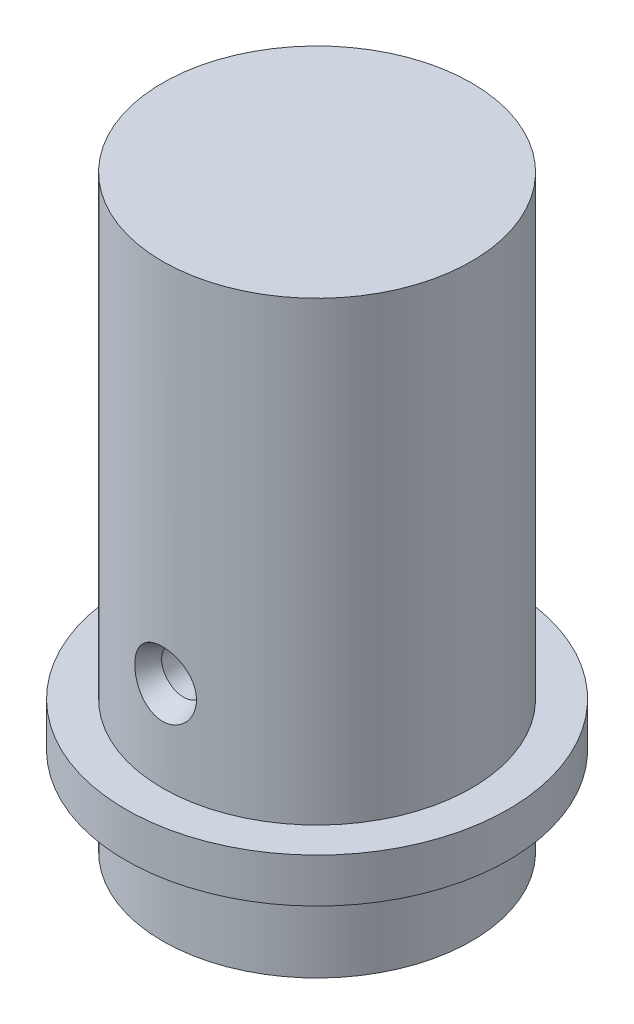
ISO-10303-21;
HEADER;
FILE_DESCRIPTION(('STEP AP214'),'2;1');
FILE_NAME('part.step','',(''),(''),'','','');
FILE_SCHEMA(('AUTOMOTIVE_DESIGN { 1 0 10303 214 1 1 1 1 }'));
ENDSEC;
DATA;
#1=APPLICATION_CONTEXT('core data for automotive mechanical design processes');
#2=APPLICATION_PROTOCOL_DEFINITION('international standard','automotive_design',2000,#1);
#3=PRODUCT_CONTEXT('',#1,'mechanical');
#4=PRODUCT('Part','Part','',(#3));
#5=PRODUCT_RELATED_PRODUCT_CATEGORY('part','',(#4));
#6=PRODUCT_DEFINITION_FORMATION('','',#4);
#7=PRODUCT_DEFINITION_CONTEXT('part definition',#1,'design');
#8=PRODUCT_DEFINITION('design','',#6,#7);
#9=PRODUCT_DEFINITION_SHAPE('','',#8);
#10=(LENGTH_UNIT() NAMED_UNIT(*) SI_UNIT(.MILLI.,.METRE.));
#11=(NAMED_UNIT(*) PLANE_ANGLE_UNIT() SI_UNIT($,.RADIAN.));
#12=(NAMED_UNIT(*) SI_UNIT($,.STERADIAN.) SOLID_ANGLE_UNIT());
#13=UNCERTAINTY_MEASURE_WITH_UNIT(LENGTH_MEASURE(1.E-05),#10,'distance_accuracy_value','');
#14=(GEOMETRIC_REPRESENTATION_CONTEXT(3) GLOBAL_UNCERTAINTY_ASSIGNED_CONTEXT((#13)) GLOBAL_UNIT_ASSIGNED_CONTEXT((#10,
#11,#12)) REPRESENTATION_CONTEXT('',''));
#15=CARTESIAN_POINT('',(0.,0.,0.));
#16=DIRECTION('',(0.,0.,1.));
#17=DIRECTION('',(1.,0.,0.));
#18=AXIS2_PLACEMENT_3D('',#15,#16,#17);
#19=CARTESIAN_POINT('',(0.,40.,0.));
#20=DIRECTION('',(0.,-1.,0.));
#21=DIRECTION('',(0.,0.,-1.));
#22=AXIS2_PLACEMENT_3D('',#19,#20,#21);
#23=CYLINDRICAL_SURFACE('',#22,10.5);
#24=CARTESIAN_POINT('',(0.,9.,0.));
#25=DIRECTION('',(0.,-1.,0.));
#26=DIRECTION('',(0.,0.,-1.));
#27=AXIS2_PLACEMENT_3D('',#24,#25,#26);
#28=CIRCLE('',#27,10.5);
#29=CARTESIAN_POINT('',(0.,9.,-10.5));
#30=VERTEX_POINT('',#29);
#31=EDGE_CURVE('E10',#30,#30,#28,.T.);
#32=ORIENTED_EDGE('',*,*,#31,.F.);
#33=EDGE_LOOP('',(#32));
#34=FACE_BOUND('',#33,.T.);
#35=CARTESIAN_POINT('',(0.,40.,0.));
#36=DIRECTION('',(0.,1.,0.));
#37=DIRECTION('',(0.,0.,1.));
#38=AXIS2_PLACEMENT_3D('',#35,#36,#37);
#39=CIRCLE('',#38,10.5);
#40=CARTESIAN_POINT('',(0.,40.,10.5));
#41=VERTEX_POINT('',#40);
#42=EDGE_CURVE('E38',#41,#41,#39,.T.);
#43=ORIENTED_EDGE('',*,*,#42,.F.);
#44=EDGE_LOOP('',(#43));
#45=FACE_BOUND('',#44,.T.);
#46=CARTESIAN_POINT('',(-1.52469204945831,13.6219706714514,10.3887109641234));
#47=CARTESIAN_POINT('',(-1.60898763701267,13.7156825075255,10.3763397227627));
#48=CARTESIAN_POINT('',(-1.68514598382751,13.8168557433645,10.3641149246432));
#49=CARTESIAN_POINT('',(-1.81927397459337,14.0309034159791,10.3414167234592));
#50=CARTESIAN_POINT('',(-1.87721904707924,14.1437933891339,10.3309456952149));
#51=CARTESIAN_POINT('',(-1.97274231211096,14.3760631296765,10.313128463846));
#52=CARTESIAN_POINT('',(-2.01062135972944,14.495315672735,10.3057364788575));
#53=CARTESIAN_POINT('',(-2.0664778479577,14.738511325679,10.2946824985625));
#54=CARTESIAN_POINT('',(-2.08446218119772,14.86245279566,10.2910192114637));
#55=CARTESIAN_POINT('',(-2.10025954529575,15.1136273730536,10.2878073887898));
#56=CARTESIAN_POINT('',(-2.09775179130123,15.2408816185773,10.2883242889223));
#57=CARTESIAN_POINT('',(-2.07185623984035,15.4931740608266,10.293569912308));
#58=CARTESIAN_POINT('',(-2.04846574754945,15.6182119694198,10.2982991791481));
#59=CARTESIAN_POINT('',(-1.98131972415452,15.862656555306,10.3114273845948));
#60=CARTESIAN_POINT('',(-1.93754011724393,15.9820563909893,10.3198306608127));
#61=CARTESIAN_POINT('',(-1.83062888675253,16.2116330714951,10.3393295922992));
#62=CARTESIAN_POINT('',(-1.76749649822119,16.3218095515302,10.3504253539889));
#63=CARTESIAN_POINT('',(-1.62381939284009,16.5289613641369,10.3739317397581));
#64=CARTESIAN_POINT('',(-1.54338887413292,16.6260167833818,10.3863334803754));
#65=CARTESIAN_POINT('',(-1.36680925944822,16.8046304252117,10.411040075834));
#66=CARTESIAN_POINT('',(-1.27066261851477,16.8861910639686,10.4233449454936));
#67=CARTESIAN_POINT('',(-1.0684734587459,17.0285577868252,10.445973547892));
#68=CARTESIAN_POINT('',(-0.962846730821703,17.0899451454956,10.4563481265217));
#69=CARTESIAN_POINT('',(-0.742179436765606,17.1930626109519,10.4743204200025));
#70=CARTESIAN_POINT('',(-0.627142840966643,17.234800958598,10.4819192986911));
#71=CARTESIAN_POINT('',(-0.397882463839441,17.2950880185577,10.4930507081479));
#72=CARTESIAN_POINT('',(-0.28397617573595,17.3148079117597,10.4967877239058));
#73=CARTESIAN_POINT('',(-0.054419128088662,17.3343247180779,10.5004856378266));
#74=CARTESIAN_POINT('',(0.0612311523821333,17.3341270063364,10.5004475547713));
#75=CARTESIAN_POINT('',(0.286199102590441,17.314229393881,10.4966786998477));
#76=CARTESIAN_POINT('',(0.395587720649714,17.2952912446824,10.4930921646359));
#77=CARTESIAN_POINT('',(0.609630873956106,17.239782193411,10.4828353614431));
#78=CARTESIAN_POINT('',(0.71428527533121,17.2032107930536,10.476165006319));
#79=CARTESIAN_POINT('',(0.917277795946247,17.1132515404162,10.4603581888251));
#80=CARTESIAN_POINT('',(1.01553255127883,17.0596808673874,10.4511950783374));
#81=CARTESIAN_POINT('',(1.2021169433497,16.9376261254006,10.4313821268047));
#82=CARTESIAN_POINT('',(1.2904444439165,16.8691388559311,10.4207319668741));
#83=CARTESIAN_POINT('',(1.45939945056752,16.7155176355014,10.3984509359306));
#84=CARTESIAN_POINT('',(1.53942450117462,16.6297245666961,10.3867976380376));
#85=CARTESIAN_POINT('',(1.68475433547623,16.4463825115283,10.3642185018926));
#86=CARTESIAN_POINT('',(1.75005545850027,16.3488306109097,10.3532928450217));
#87=CARTESIAN_POINT('',(1.86750003870699,16.1393810276736,10.3327725673317));
#88=CARTESIAN_POINT('',(1.91881349211444,16.0270078908466,10.3232729046685));
#89=CARTESIAN_POINT('',(2.00258775417444,15.7952355918864,10.3073502628411));
#90=CARTESIAN_POINT('',(2.03504625355797,15.6758355711039,10.3009276605581));
#91=CARTESIAN_POINT('',(2.08092847123061,15.4302893665393,10.2917592180335));
#92=CARTESIAN_POINT('',(2.09387297305115,15.3040498714766,10.2891060327343));
#93=CARTESIAN_POINT('',(2.09890481355014,15.0511370435498,10.2880807152335));
#94=CARTESIAN_POINT('',(2.09099122170906,14.9244636915823,10.2897087740263));
#95=CARTESIAN_POINT('',(2.05442145532466,14.673739728389,10.2970722688311));
#96=CARTESIAN_POINT('',(2.02568111119459,14.5497018685603,10.3028243708165));
#97=CARTESIAN_POINT('',(1.94804341259495,14.3083110062454,10.3177845780921));
#98=CARTESIAN_POINT('',(1.8991448527091,14.1909584040003,10.326992890053));
#99=CARTESIAN_POINT('',(1.78246534024014,13.9666033396917,10.3477682081547));
#100=CARTESIAN_POINT('',(1.71472716851978,13.8595781592664,10.3593298545943));
#101=CARTESIAN_POINT('',(1.56190116354591,13.6588293177101,10.3834690592626));
#102=CARTESIAN_POINT('',(1.47681412738432,13.5651050458054,10.3960465708013));
#103=CARTESIAN_POINT('',(1.29329208035275,13.3958304368903,10.4204496753492));
#104=CARTESIAN_POINT('',(1.19516596901244,13.319947340583,10.4322853900767));
#105=CARTESIAN_POINT('',(0.986858967322807,13.1866956665471,10.4540442828817));
#106=CARTESIAN_POINT('',(0.876682356135947,13.1293205449893,10.4639681364313));
#107=CARTESIAN_POINT('',(0.653322585362347,13.0377980383434,10.4802224424174));
#108=CARTESIAN_POINT('',(0.54057130292731,13.0026251231189,10.4867088824208));
#109=CARTESIAN_POINT('',(0.310520072965496,12.9525486992137,10.4960374462676));
#110=CARTESIAN_POINT('',(0.19322196867976,12.9376370633757,10.4988810312984));
#111=CARTESIAN_POINT('',(-0.0361492620521398,12.9289481128939,10.5005323614195));
#112=CARTESIAN_POINT('',(-0.148182791042326,12.9341288915183,10.4995390808606));
#113=CARTESIAN_POINT('',(-0.36974208416032,12.9630957205178,10.4940731339053));
#114=CARTESIAN_POINT('',(-0.479267560293101,12.9868838966283,10.4896000699738));
#115=CARTESIAN_POINT('',(-0.691834575400948,13.051864611386,10.4777202228267));
#116=CARTESIAN_POINT('',(-0.79492203927316,13.0929123747358,10.4703378746147));
#117=CARTESIAN_POINT('',(-0.992943963326352,13.190928741154,10.4534174089847));
#118=CARTESIAN_POINT('',(-1.08788426011382,13.2478858202408,10.4438808529294));
#119=CARTESIAN_POINT('',(-1.24100508047653,13.3570053187943,10.4265999374333));
#120=CARTESIAN_POINT('',(-1.301775401461,13.4056372231508,10.4191552352669));
#121=CARTESIAN_POINT('',(-1.4176263553704,13.5092234358356,10.4040254557878));
#122=CARTESIAN_POINT('',(-1.47270659723003,13.5641781781692,10.3963403620008));
#123=CARTESIAN_POINT('',(-1.52469204945831,13.6219706714514,10.3887109641234));
#124=B_SPLINE_CURVE_WITH_KNOTS('',3,(#46,#47,#48,#49,#50,#51,#52,#53,#54,#55,#56,#57,#58,#59,
#60,#61,#62,#63,#64,#65,#66,#67,#68,#69,#70,#71,#72,#73,#74,#75,#76,#77,#78,#79,#80,#81,#82,#83,
#84,#85,#86,#87,#88,#89,#90,#91,#92,#93,#94,#95,#96,#97,#98,#99,#100,#101,#102,#103,#104,#105,
#106,#107,#108,#109,#110,#111,#112,#113,#114,#115,#116,#117,#118,#119,#120,#121,#122,#123),
.UNSPECIFIED.,.T.,.F.,(4,2,2,2,2,2,2,2,2,2,2,2,2,2,2,2,2,2,2,2,2,2,2,2,2,2,2,2,2,2,2,2,2,2,2,2,
2,2,4),(0.,0.379659122663664,0.759828265294093,1.13412341788082,1.50828885325684,
1.88832259499367,2.26840538548503,2.64893812645467,3.02948591054704,3.40759456862608,
3.78564421801044,4.15158053191785,4.51736323389215,4.86259386268306,5.20773132471094,
5.53939312206608,5.87106429214685,6.20643077590976,6.54186928706119,6.89401141643003,
7.24624099925701,7.61624047449309,7.98628525603299,8.36527732300092,8.74428629781771,
9.1248356096893,9.5054076808614,9.88512250998004,10.2648198970666,10.6367445799411,
11.0085376176157,11.3615796203614,11.714479969871,12.0493312688726,12.3842208273464,
12.7163556344662,13.0482504794319,13.282371817122,13.5165092347127),.UNSPECIFIED.);
#125=CARTESIAN_POINT('',(-1.52469204945831,13.6219706714514,10.3887109641234));
#126=VERTEX_POINT('',#125);
#127=EDGE_CURVE('E48',#126,#126,#124,.T.);
#128=ORIENTED_EDGE('',*,*,#127,.T.);
#129=EDGE_LOOP('',(#128));
#130=FACE_BOUND('',#129,.T.);
#131=CARTESIAN_POINT('',(-1.52469204945832,13.6219706714514,-10.3887109641234));
#132=CARTESIAN_POINT('',(-1.60898763701267,13.7156825075255,-10.3763397227627));
#133=CARTESIAN_POINT('',(-1.68514598382752,13.8168557433645,-10.3641149246432));
#134=CARTESIAN_POINT('',(-1.81927397459338,14.0309034159791,-10.3414167234592));
#135=CARTESIAN_POINT('',(-1.87721904707924,14.1437933891339,-10.3309456952149));
#136=CARTESIAN_POINT('',(-1.97274231211096,14.3760631296765,-10.313128463846));
#137=CARTESIAN_POINT('',(-2.01062135972944,14.495315672735,-10.3057364788575));
#138=CARTESIAN_POINT('',(-2.0664778479577,14.738511325679,-10.2946824985625));
#139=CARTESIAN_POINT('',(-2.08446218119772,14.86245279566,-10.2910192114637));
#140=CARTESIAN_POINT('',(-2.10025954529575,15.1136273730536,-10.2878073887898));
#141=CARTESIAN_POINT('',(-2.09775179130123,15.2408816185773,-10.2883242889223));
#142=CARTESIAN_POINT('',(-2.07185623984035,15.4931740608266,-10.293569912308));
#143=CARTESIAN_POINT('',(-2.04846574754945,15.6182119694198,-10.2982991791481));
#144=CARTESIAN_POINT('',(-1.98131972415452,15.862656555306,-10.3114273845948));
#145=CARTESIAN_POINT('',(-1.93754011724393,15.9820563909893,-10.3198306608127));
#146=CARTESIAN_POINT('',(-1.83062888675253,16.2116330714951,-10.3393295922992));
#147=CARTESIAN_POINT('',(-1.76749649822119,16.3218095515302,-10.3504253539889));
#148=CARTESIAN_POINT('',(-1.62381939284009,16.5289613641369,-10.3739317397581));
#149=CARTESIAN_POINT('',(-1.54338887413292,16.6260167833818,-10.3863334803754));
#150=CARTESIAN_POINT('',(-1.36680925944822,16.8046304252117,-10.411040075834));
#151=CARTESIAN_POINT('',(-1.27066261851477,16.8861910639686,-10.4233449454936));
#152=CARTESIAN_POINT('',(-1.0684734587459,17.0285577868252,-10.445973547892));
#153=CARTESIAN_POINT('',(-0.962846730821698,17.0899451454956,-10.4563481265217));
#154=CARTESIAN_POINT('',(-0.742179436765601,17.1930626109519,-10.4743204200025));
#155=CARTESIAN_POINT('',(-0.627142840966638,17.234800958598,-10.4819192986911));
#156=CARTESIAN_POINT('',(-0.397882463839436,17.2950880185577,-10.4930507081479));
#157=CARTESIAN_POINT('',(-0.283976175735946,17.3148079117597,-10.4967877239058));
#158=CARTESIAN_POINT('',(-0.0544191280886587,17.3343247180779,-10.5004856378266));
#159=CARTESIAN_POINT('',(0.0612311523821361,17.3341270063364,-10.5004475547713));
#160=CARTESIAN_POINT('',(0.286199102590443,17.314229393881,-10.4966786998477));
#161=CARTESIAN_POINT('',(0.395587720649715,17.2952912446824,-10.4930921646359));
#162=CARTESIAN_POINT('',(0.609630873956108,17.239782193411,-10.4828353614431));
#163=CARTESIAN_POINT('',(0.714285275331213,17.2032107930536,-10.476165006319));
#164=CARTESIAN_POINT('',(0.917277795946248,17.1132515404162,-10.4603581888251));
#165=CARTESIAN_POINT('',(1.01553255127883,17.0596808673874,-10.4511950783374));
#166=CARTESIAN_POINT('',(1.2021169433497,16.9376261254005,-10.4313821268047));
#167=CARTESIAN_POINT('',(1.2904444439165,16.8691388559311,-10.4207319668741));
#168=CARTESIAN_POINT('',(1.45939945056752,16.7155176355014,-10.3984509359306));
#169=CARTESIAN_POINT('',(1.53942450117462,16.6297245666961,-10.3867976380376));
#170=CARTESIAN_POINT('',(1.68475433547623,16.4463825115283,-10.3642185018926));
#171=CARTESIAN_POINT('',(1.75005545850027,16.3488306109097,-10.3532928450217));
#172=CARTESIAN_POINT('',(1.86750003870699,16.1393810276736,-10.3327725673317));
#173=CARTESIAN_POINT('',(1.91881349211444,16.0270078908466,-10.3232729046685));
#174=CARTESIAN_POINT('',(2.00258775417444,15.7952355918864,-10.3073502628411));
#175=CARTESIAN_POINT('',(2.03504625355797,15.6758355711039,-10.3009276605581));
#176=CARTESIAN_POINT('',(2.08092847123061,15.4302893665393,-10.2917592180335));
#177=CARTESIAN_POINT('',(2.09387297305114,15.3040498714766,-10.2891060327343));
#178=CARTESIAN_POINT('',(2.09890481355014,15.0511370435498,-10.2880807152335));
#179=CARTESIAN_POINT('',(2.09099122170906,14.9244636915823,-10.2897087740263));
#180=CARTESIAN_POINT('',(2.05442145532466,14.673739728389,-10.2970722688311));
#181=CARTESIAN_POINT('',(2.02568111119459,14.5497018685603,-10.3028243708165));
#182=CARTESIAN_POINT('',(1.94804341259495,14.3083110062454,-10.3177845780921));
#183=CARTESIAN_POINT('',(1.8991448527091,14.1909584040003,-10.326992890053));
#184=CARTESIAN_POINT('',(1.78246534024014,13.9666033396916,-10.3477682081547));
#185=CARTESIAN_POINT('',(1.71472716851978,13.8595781592664,-10.3593298545943));
#186=CARTESIAN_POINT('',(1.56190116354591,13.6588293177101,-10.3834690592626));
#187=CARTESIAN_POINT('',(1.47681412738432,13.5651050458054,-10.3960465708013));
#188=CARTESIAN_POINT('',(1.29329208035275,13.3958304368903,-10.4204496753492));
#189=CARTESIAN_POINT('',(1.19516596901244,13.319947340583,-10.4322853900767));
#190=CARTESIAN_POINT('',(0.986858967322805,13.1866956665471,-10.4540442828817));
#191=CARTESIAN_POINT('',(0.876682356135944,13.1293205449893,-10.4639681364313));
#192=CARTESIAN_POINT('',(0.653322585362342,13.0377980383434,-10.4802224424174));
#193=CARTESIAN_POINT('',(0.540571302927305,13.0026251231189,-10.4867088824208));
#194=CARTESIAN_POINT('',(0.310520072965492,12.9525486992137,-10.4960374462676));
#195=CARTESIAN_POINT('',(0.193221968679756,12.9376370633757,-10.4988810312984));
#196=CARTESIAN_POINT('',(-0.0361492620521437,12.9289481128939,-10.5005323614195));
#197=CARTESIAN_POINT('',(-0.14818279104233,12.9341288915183,-10.4995390808606));
#198=CARTESIAN_POINT('',(-0.369742084160325,12.9630957205178,-10.4940731339053));
#199=CARTESIAN_POINT('',(-0.479267560293106,12.9868838966283,-10.4896000699738));
#200=CARTESIAN_POINT('',(-0.691834575400953,13.051864611386,-10.4777202228267));
#201=CARTESIAN_POINT('',(-0.794922039273165,13.0929123747358,-10.4703378746147));
#202=CARTESIAN_POINT('',(-0.992943963326357,13.190928741154,-10.4534174089847));
#203=CARTESIAN_POINT('',(-1.08788426011383,13.2478858202408,-10.4438808529294));
#204=CARTESIAN_POINT('',(-1.24100508047653,13.3570053187943,-10.4265999374333));
#205=CARTESIAN_POINT('',(-1.301775401461,13.4056372231508,-10.4191552352669));
#206=CARTESIAN_POINT('',(-1.4176263553704,13.5092234358356,-10.4040254557878));
#207=CARTESIAN_POINT('',(-1.47270659723003,13.5641781781692,-10.3963403620008));
#208=CARTESIAN_POINT('',(-1.52469204945832,13.6219706714514,-10.3887109641234));
#209=B_SPLINE_CURVE_WITH_KNOTS('',3,(#131,#132,#133,#134,#135,#136,#137,#138,#139,#140,#141,
#142,#143,#144,#145,#146,#147,#148,#149,#150,#151,#152,#153,#154,#155,#156,#157,#158,#159,#160,
#161,#162,#163,#164,#165,#166,#167,#168,#169,#170,#171,#172,#173,#174,#175,#176,#177,#178,#179,
#180,#181,#182,#183,#184,#185,#186,#187,#188,#189,#190,#191,#192,#193,#194,#195,#196,#197,#198,
#199,#200,#201,#202,#203,#204,#205,#206,#207,#208),.UNSPECIFIED.,.T.,.F.,(4,2,2,2,2,2,2,2,2,2,2,
2,2,2,2,2,2,2,2,2,2,2,2,2,2,2,2,2,2,2,2,2,2,2,2,2,2,2,4),(0.,0.379659122663662,
0.759828265294094,1.13412341788082,1.50828885325684,1.88832259499366,2.26840538548503,
2.64893812645466,3.02948591054704,3.40759456862608,3.78564421801044,4.15158053191785,
4.51736323389216,4.86259386268306,5.20773132471094,5.53939312206608,5.87106429214684,
6.20643077590975,6.54186928706119,6.89401141643002,7.24624099925701,7.61624047449309,
7.98628525603299,8.36527732300093,8.74428629781771,9.12483560968931,9.50540768086141,
9.88512250998004,10.2648198970666,10.6367445799411,11.0085376176157,11.3615796203614,
11.714479969871,12.0493312688726,12.3842208273464,12.7163556344662,13.0482504794319,
13.2823718171221,13.5165092347127),.UNSPECIFIED.);
#210=CARTESIAN_POINT('',(-1.52469204945832,13.6219706714514,-10.3887109641234));
#211=VERTEX_POINT('',#210);
#212=EDGE_CURVE('E49',#211,#211,#209,.T.);
#213=ORIENTED_EDGE('',*,*,#212,.F.);
#214=EDGE_LOOP('',(#213));
#215=FACE_BOUND('',#214,.T.);
#216=ADVANCED_FACE('F29',(#34,#45,#130,#215),#23,.T.);
#217=CARTESIAN_POINT('',(0.,15.1317492037241,-14.));
#218=DIRECTION('',(0.,0.,1.));
#219=DIRECTION('',(1.,0.,0.));
#220=AXIS2_PLACEMENT_3D('',#217,#218,#219);
#221=CYLINDRICAL_SURFACE('',#220,1.5);
#222=CARTESIAN_POINT('',(0.,16.6317492037241,-2.5));
#223=CARTESIAN_POINT('',(0.0767298334620158,16.6317451127142,-2.49999625789732));
#224=CARTESIAN_POINT('',(0.153582320644178,16.6258205327979,-2.4964290461501));
#225=CARTESIAN_POINT('',(0.304975509530678,16.6024248842088,-2.48249903608568));
#226=CARTESIAN_POINT('',(0.379510034596046,16.5849253418699,-2.47211948032719));
#227=CARTESIAN_POINT('',(0.523751827790835,16.5393628425573,-2.44561558054488));
#228=CARTESIAN_POINT('',(0.593481028226564,16.511352245561,-2.42951973272944));
#229=CARTESIAN_POINT('',(0.727030318214656,16.4458888705831,-2.39295367626407));
#230=CARTESIAN_POINT('',(0.790851869416381,16.4084384367554,-2.37248455380255));
#231=CARTESIAN_POINT('',(0.916299278999313,16.3219743770155,-2.32705360719088));
#232=CARTESIAN_POINT('',(0.977384020081413,16.2722955083727,-2.30186792195985));
#233=CARTESIAN_POINT('',(1.09088270411891,16.1642819998959,-2.25030439279634));
#234=CARTESIAN_POINT('',(1.14328534948112,16.1059362665368,-2.22392505153571));
#235=CARTESIAN_POINT('',(1.24444996762974,15.9738256932274,-2.1691106699591));
#236=CARTESIAN_POINT('',(1.29197766378809,15.8990474327428,-2.14082017703649));
#237=CARTESIAN_POINT('',(1.37361437764896,15.740902630481,-2.08938301412124));
#238=CARTESIAN_POINT('',(1.40774517335159,15.6575503074766,-2.06622802273938));
#239=CARTESIAN_POINT('',(1.45440601714221,15.5051527530709,-2.0335462966093));
#240=CARTESIAN_POINT('',(1.47016197246826,15.4375132051138,-2.02207883137591));
#241=CARTESIAN_POINT('',(1.49216172340475,15.2999454878938,-2.00590308295503));
#242=CARTESIAN_POINT('',(1.49841734556836,15.2300202749696,-2.00118639643759));
#243=CARTESIAN_POINT('',(1.50105508796009,15.0897377095068,-1.99920922463856));
#244=CARTESIAN_POINT('',(1.49741783408419,15.0193797786309,-2.00196337012718));
#245=CARTESIAN_POINT('',(1.48046060478828,14.8804704282965,-2.01453261443741));
#246=CARTESIAN_POINT('',(1.46713334620103,14.8119204078767,-2.02435302432226));
#247=CARTESIAN_POINT('',(1.43173921881792,14.679218961596,-2.04953186944258));
#248=CARTESIAN_POINT('',(1.40978748666087,14.6150221497996,-2.06481711652537));
#249=CARTESIAN_POINT('',(1.35795061770837,14.491054212796,-2.09927051350828));
#250=CARTESIAN_POINT('',(1.32806257259705,14.4312847203002,-2.11844008623465));
#251=CARTESIAN_POINT('',(1.25517983184583,14.3067651066013,-2.16255327268985));
#252=CARTESIAN_POINT('',(1.21080724397723,14.2429711107692,-2.18792043372992));
#253=CARTESIAN_POINT('',(1.11291092784003,14.1230727200571,-2.23930599764381));
#254=CARTESIAN_POINT('',(1.05937845100579,14.0669757697476,-2.26532500262149));
#255=CARTESIAN_POINT('',(0.935811834382966,13.9561362219024,-2.31935504958317));
#256=CARTESIAN_POINT('',(0.864517682704957,13.9026718977081,-2.34713836268532));
#257=CARTESIAN_POINT('',(0.712276050459,13.8086271565262,-2.39772428433981));
#258=CARTESIAN_POINT('',(0.631333763943564,13.7680398499342,-2.42052955425515));
#259=CARTESIAN_POINT('',(0.467197585268206,13.7038170209282,-2.45730392066151));
#260=CARTESIAN_POINT('',(0.384467624173581,13.6792738480082,-2.47173957439704));
#261=CARTESIAN_POINT('',(0.21504789514464,13.6447380063187,-2.49218842813551));
#262=CARTESIAN_POINT('',(0.12836300566132,13.6347278859705,-2.49821172952738));
#263=CARTESIAN_POINT('',(-0.0337146143773953,13.6302413560458,-2.5009057037461));
#264=CARTESIAN_POINT('',(-0.109042473418716,13.6338403486389,-2.49873521714286));
#265=CARTESIAN_POINT('',(-0.257829401986059,13.652175056796,-2.48778712087048));
#266=CARTESIAN_POINT('',(-0.331288509376105,13.6669105465299,-2.47900964518037));
#267=CARTESIAN_POINT('',(-0.472574932157612,13.7062926365366,-2.4559479244219));
#268=CARTESIAN_POINT('',(-0.540495750928483,13.7306895527976,-2.44180275662555));
#269=CARTESIAN_POINT('',(-0.671265749087262,13.7884265800894,-2.40913880862845));
#270=CARTESIAN_POINT('',(-0.734113924963907,13.8217684550708,-2.39061916586511));
#271=CARTESIAN_POINT('',(-0.860006262823863,13.9003061829328,-2.3484549623736));
#272=CARTESIAN_POINT('',(-0.922394150456836,13.9463730328025,-2.3244780273988));
#273=CARTESIAN_POINT('',(-1.03902603131014,14.0471405972127,-2.27474265574732));
#274=CARTESIAN_POINT('',(-1.09326040273738,14.1018513585767,-2.2489821658636));
#275=CARTESIAN_POINT('',(-1.19931996735579,14.2266595937613,-2.19445423909891));
#276=CARTESIAN_POINT('',(-1.24991019630915,14.2978330891896,-2.16573241746291));
#277=CARTESIAN_POINT('',(-1.33845238915667,14.4489652282923,-2.1121618206671));
#278=CARTESIAN_POINT('',(-1.37641766769781,14.5289144976169,-2.0873089799769));
#279=CARTESIAN_POINT('',(-1.43142578795776,14.6779922260308,-2.04984909240519));
#280=CARTESIAN_POINT('',(-1.4512162533619,14.7457295160827,-2.03575659328729));
#281=CARTESIAN_POINT('',(-1.48113663905972,14.8842812818042,-2.01409605743544));
#282=CARTESIAN_POINT('',(-1.49127995297631,14.955091348052,-2.00651897642721));
#283=CARTESIAN_POINT('',(-1.50134130416631,15.0981261513212,-1.99900446616268));
#284=CARTESIAN_POINT('',(-1.50122089107869,15.1703551944112,-1.99909576445937));
#285=CARTESIAN_POINT('',(-1.49066472959328,15.3136436393336,-2.0069771789285));
#286=CARTESIAN_POINT('',(-1.48022337215759,15.3847023838047,-2.0147714813882));
#287=CARTESIAN_POINT('',(-1.45040174148913,15.5202376212963,-2.0363318524298));
#288=CARTESIAN_POINT('',(-1.43147636845351,15.584866298031,-2.04979211805581));
#289=CARTESIAN_POINT('',(-1.38563242076993,15.7100864581983,-2.08105501960152));
#290=CARTESIAN_POINT('',(-1.35871083588479,15.7706764106847,-2.09885929040482));
#291=CARTESIAN_POINT('',(-1.29289245555732,15.8960690609449,-2.14012990550917));
#292=CARTESIAN_POINT('',(-1.25279167675753,15.9600903075784,-2.16404587582639));
#293=CARTESIAN_POINT('',(-1.16375698389084,16.0811292763414,-2.21320127030768));
#294=CARTESIAN_POINT('',(-1.11481579607798,16.1381411658767,-2.23844177205021));
#295=CARTESIAN_POINT('',(-1.00009777425734,16.2531001528558,-2.29225690291477));
#296=CARTESIAN_POINT('',(-0.932876819313901,16.3096802786203,-2.32070308663658));
#297=CARTESIAN_POINT('',(-0.788462434445585,16.4108470595874,-2.37365428872367));
#298=CARTESIAN_POINT('',(-0.711265444501536,16.4554294157089,-2.39815789310936));
#299=CARTESIAN_POINT('',(-0.55112523080145,16.5295350112979,-2.43985578654394));
#300=CARTESIAN_POINT('',(-0.46843008695721,16.559477268651,-2.45725077479787));
#301=CARTESIAN_POINT('',(-0.297973306118804,16.6044738989351,-2.48366273001246));
#302=CARTESIAN_POINT('',(-0.210232099648609,16.6195843715811,-2.49271125871485));
#303=CARTESIAN_POINT('',(-0.101558096917533,16.6284466584328,-2.49802001168187));
#304=CARTESIAN_POINT('',(-0.0812762590282743,16.6296836210302,-2.49876114656362));
#305=CARTESIAN_POINT('',(-0.0406658206871105,16.631335450095,-2.49975164517367));
#306=CARTESIAN_POINT('',(-0.0203372186375685,16.631750288045,-2.50000099184316));
#307=CARTESIAN_POINT('',(0.,16.6317492037241,-2.5));
#308=B_SPLINE_CURVE_WITH_KNOTS('',3,(#222,#223,#224,#225,#226,#227,#228,#229,#230,#231,#232,
#233,#234,#235,#236,#237,#238,#239,#240,#241,#242,#243,#244,#245,#246,#247,#248,#249,#250,#251,
#252,#253,#254,#255,#256,#257,#258,#259,#260,#261,#262,#263,#264,#265,#266,#267,#268,#269,#270,
#271,#272,#273,#274,#275,#276,#277,#278,#279,#280,#281,#282,#283,#284,#285,#286,#287,#288,#289,
#290,#291,#292,#293,#294,#295,#296,#297,#298,#299,#300,#301,#302,#303,#304,#305,#306,#307),
.UNSPECIFIED.,.T.,.F.,(4,2,2,2,2,2,2,2,2,2,2,2,2,2,2,2,2,2,2,2,2,2,2,2,2,2,2,2,2,2,2,2,2,2,2,2,
2,2,2,2,2,2,4),(0.,0.230102237548649,0.460772627520011,0.690308884600008,0.919788197992273,
1.16681590732472,1.414162579348,1.69183813189807,1.96906040692091,2.17933829855633,
2.38935420916578,2.59978170870726,2.81036753273872,3.01823267593207,3.22617409809868,
3.47046995225162,3.71500044803674,3.99360957884691,4.27206939275324,4.53296790696559,
4.79355286918236,5.01875602722426,5.24395461863455,5.46367785689772,5.68344445659025,
5.92601365818362,6.16886690081836,6.44336762428009,6.71757792616455,6.93257787314692,
7.14727888733318,7.36278425777433,7.57840681155725,7.78364098331142,7.98895251523035,
8.22578610052285,8.46281544370208,8.73854311775519,9.01436946031985,9.28175654462677,
9.54812832184448,9.60911473335177,9.6701032602764),.UNSPECIFIED.);
#309=CARTESIAN_POINT('',(0.,16.6317492037241,-2.5));
#310=VERTEX_POINT('',#309);
#311=EDGE_CURVE('E86',#310,#310,#308,.T.);
#312=ORIENTED_EDGE('',*,*,#311,.F.);
#313=EDGE_LOOP('',(#312));
#314=FACE_BOUND('',#313,.T.);
#315=CARTESIAN_POINT('',(0.,15.1317492037241,-9.06478731089449));
#316=DIRECTION('',(0.,0.,-1.));
#317=DIRECTION('',(-1.,0.,0.));
#318=AXIS2_PLACEMENT_3D('',#315,#316,#317);
#319=CIRCLE('',#318,1.5);
#320=CARTESIAN_POINT('',(-1.5,15.1317492037241,-9.06478731089449));
#321=VERTEX_POINT('',#320);
#322=EDGE_CURVE('E34',#321,#321,#319,.F.);
#323=ORIENTED_EDGE('',*,*,#322,.F.);
#324=EDGE_LOOP('',(#323));
#325=FACE_BOUND('',#324,.T.);
#326=ADVANCED_FACE('F77',(#314,#325),#221,.F.);
#327=CARTESIAN_POINT('',(0.,6.,0.));
#328=DIRECTION('',(0.,-1.,0.));
#329=DIRECTION('',(0.,0.,-1.));
#330=AXIS2_PLACEMENT_3D('',#327,#328,#329);
#331=CIRCLE('',#330,10.5);
#332=CARTESIAN_POINT('',(0.,6.,-10.5));
#333=VERTEX_POINT('',#332);
#334=EDGE_CURVE('E223',#333,#333,#331,.T.);
#335=ORIENTED_EDGE('',*,*,#334,.T.);
#336=EDGE_LOOP('',(#335));
#337=FACE_BOUND('',#336,.T.);
#338=CARTESIAN_POINT('',(0.,0.,0.));
#339=DIRECTION('',(0.,1.,0.));
#340=DIRECTION('',(0.,0.,1.));
#341=AXIS2_PLACEMENT_3D('',#338,#339,#340);
#342=CIRCLE('',#341,10.5);
#343=CARTESIAN_POINT('',(0.,0.,10.5));
#344=VERTEX_POINT('',#343);
#345=EDGE_CURVE('E43',#344,#344,#342,.T.);
#346=ORIENTED_EDGE('',*,*,#345,.T.);
#347=EDGE_LOOP('',(#346));
#348=FACE_BOUND('',#347,.T.);
#349=ADVANCED_FACE('F31',(#337,#348),#23,.T.);
#350=CARTESIAN_POINT('',(0.,0.,0.));
#351=DIRECTION('',(0.,1.,0.));
#352=DIRECTION('',(0.,0.,1.));
#353=AXIS2_PLACEMENT_3D('',#350,#351,#352);
#354=PLANE('',#353);
#355=CARTESIAN_POINT('',(0.,0.,0.));
#356=DIRECTION('',(0.,-1.,0.));
#357=DIRECTION('',(0.,0.,-1.));
#358=AXIS2_PLACEMENT_3D('',#355,#356,#357);
#359=CIRCLE('',#358,2.5);
#360=CARTESIAN_POINT('',(0.,0.,-2.5));
#361=VERTEX_POINT('',#360);
#362=EDGE_CURVE('E214',#361,#361,#359,.T.);
#363=ORIENTED_EDGE('',*,*,#362,.F.);
#364=EDGE_LOOP('',(#363));
#365=FACE_BOUND('',#364,.T.);
#366=ORIENTED_EDGE('',*,*,#345,.F.);
#367=EDGE_LOOP('',(#366));
#368=FACE_BOUND('',#367,.T.);
#369=ADVANCED_FACE('F100',(#365,#368),#354,.F.);
#370=CARTESIAN_POINT('',(0.,22.5,0.));
#371=DIRECTION('',(0.,-1.,0.));
#372=DIRECTION('',(0.,0.,-1.));
#373=AXIS2_PLACEMENT_3D('',#370,#371,#372);
#374=CYLINDRICAL_SURFACE('',#373,2.5);
#375=ORIENTED_EDGE('',*,*,#311,.T.);
#376=EDGE_LOOP('',(#375));
#377=FACE_BOUND('',#376,.T.);
#378=CARTESIAN_POINT('',(1.5,15.1317492037241,2.));
#379=CARTESIAN_POINT('',(1.50000404108592,15.2072281790138,1.99999416642512));
#380=CARTESIAN_POINT('',(1.49426852824013,15.2826876378039,2.00433633903481));
#381=CARTESIAN_POINT('',(1.47174965152787,15.4310731076863,2.02092590613883));
#382=CARTESIAN_POINT('',(1.45495475788936,15.5039963911092,2.03318155043097));
#383=CARTESIAN_POINT('',(1.41143486335795,15.6448328454014,2.0636233903473));
#384=CARTESIAN_POINT('',(1.3847815450315,15.7127780417594,2.0817666618312));
#385=CARTESIAN_POINT('',(1.32252909283019,15.843186657092,2.12185904995836));
#386=CARTESIAN_POINT('',(1.28692729054693,15.9056484334193,2.14380930122416));
#387=CARTESIAN_POINT('',(1.20271292747644,16.0316982203882,2.19228594587542));
#388=CARTESIAN_POINT('',(1.15304179435289,16.0944901608481,2.21904371037662));
#389=CARTESIAN_POINT('',(1.04426801309985,16.2115139664659,2.2722622943106));
#390=CARTESIAN_POINT('',(0.985158296729615,16.2657393553949,2.29872287517103));
#391=CARTESIAN_POINT('',(0.851442367411704,16.3698830134338,2.35175567858734));
#392=CARTESIAN_POINT('',(0.77585199516255,16.4187036673939,2.37803133577818));
#393=CARTESIAN_POINT('',(0.61565422827166,16.5025589261686,2.42443786983179));
#394=CARTESIAN_POINT('',(0.531055196626332,16.5376061778468,2.44457437988735));
#395=CARTESIAN_POINT('',(0.363771406742668,16.5893451265368,2.4747098780044));
#396=CARTESIAN_POINT('',(0.281674698130917,16.6074695646914,2.4854930393917));
#397=CARTESIAN_POINT('',(0.11497050938271,16.6296920065872,2.49874939277545));
#398=CARTESIAN_POINT('',(0.0303654624001553,16.6338031817242,2.50123038813307));
#399=CARTESIAN_POINT('',(-0.127637283737308,16.6281354563817,2.49783372711539));
#400=CARTESIAN_POINT('',(-0.201123832865633,16.6200156775548,2.49295437513726));
#401=CARTESIAN_POINT('',(-0.345464269151767,16.593269408076,2.47707997553857));
#402=CARTESIAN_POINT('',(-0.416317961051201,16.574642139817,2.46608447529309));
#403=CARTESIAN_POINT('',(-0.55405678046908,16.5275836410203,2.43884907201719));
#404=CARTESIAN_POINT('',(-0.620916491037618,16.4990961425851,2.42257910450824));
#405=CARTESIAN_POINT('',(-0.748988660115612,16.4333645874986,2.38609637638748));
#406=CARTESIAN_POINT('',(-0.810199646208011,16.3961182566651,2.36588259201812));
#407=CARTESIAN_POINT('',(-0.933074267143199,16.3089101109197,2.32037925976363));
#408=CARTESIAN_POINT('',(-0.993918663198193,16.2579608919884,2.2947718295215));
#409=CARTESIAN_POINT('',(-1.10671465909274,16.147345085864,2.24255554245601));
#410=CARTESIAN_POINT('',(-1.15865401308339,16.0876667002496,2.21594536703375));
#411=CARTESIAN_POINT('',(-1.25824837767417,15.9530957975606,2.16111075123946));
#412=CARTESIAN_POINT('',(-1.30470933188632,15.8772416271847,2.13305661385124));
#413=CARTESIAN_POINT('',(-1.38397217194232,15.7170429720875,2.08250879557267));
#414=CARTESIAN_POINT('',(-1.41679921962189,15.6327144875985,2.0600049029882));
#415=CARTESIAN_POINT('',(-1.46077497064843,15.4793555718288,2.02895865196731));
#416=CARTESIAN_POINT('',(-1.47527903312665,15.4117085714275,2.01833888618316));
#417=CARTESIAN_POINT('',(-1.49480872755284,15.2743755934246,2.00392150777558));
#418=CARTESIAN_POINT('',(-1.49984538302907,15.2046920832396,2.00011596115116));
#419=CARTESIAN_POINT('',(-1.50014781114183,15.0651975212884,1.99988914321323));
#420=CARTESIAN_POINT('',(-1.49540004697659,14.9953864265089,2.00347810223984));
#421=CARTESIAN_POINT('',(-1.47640290574941,14.8577618599756,2.01751520788652));
#422=CARTESIAN_POINT('',(-1.46214601830139,14.7899500114839,2.02796877613213));
#423=CARTESIAN_POINT('',(-1.42488312618657,14.6580346242443,2.054317683331));
#424=CARTESIAN_POINT('',(-1.40188805257362,14.5939265671919,2.07020622092812));
#425=CARTESIAN_POINT('',(-1.34796261057072,14.4702714879939,2.10571539417587));
#426=CARTESIAN_POINT('',(-1.31702924888212,14.4107261973581,2.12533743689999));
#427=CARTESIAN_POINT('',(-1.24167439558512,14.2865091212119,2.17036819177736));
#428=CARTESIAN_POINT('',(-1.19582663060303,14.2228483686276,2.19618239397369));
#429=CARTESIAN_POINT('',(-1.09487395518701,14.1034637188747,2.2482175480362));
#430=CARTESIAN_POINT('',(-1.03976018672402,14.047747511555,2.27443886711455));
#431=CARTESIAN_POINT('',(-0.913274837212769,13.9385251963737,2.32835625910913));
#432=CARTESIAN_POINT('',(-0.840721108780195,13.8862484771183,2.3558007587587));
#433=CARTESIAN_POINT('',(-0.686103100868024,13.7948464268875,2.40537639133459));
#434=CARTESIAN_POINT('',(-0.604045176134707,13.7557123758832,2.4275110444941));
#435=CARTESIAN_POINT('',(-0.438840232972143,13.6948810002928,2.46252280092775));
#436=CARTESIAN_POINT('',(-0.356205963651263,13.672122975933,2.47595588067329));
#437=CARTESIAN_POINT('',(-0.187383063890862,13.6410346008779,2.494407389061));
#438=CARTESIAN_POINT('',(-0.101198571781973,13.6326879130065,2.49943534582737));
#439=CARTESIAN_POINT('',(0.05981202320098,13.6310745951382,2.50040600461976));
#440=CARTESIAN_POINT('',(0.134620583589702,13.6359458691611,2.49747057186327));
#441=CARTESIAN_POINT('',(0.282148755978771,13.6566430281057,2.48512948412096));
#442=CARTESIAN_POINT('',(0.354868344701911,13.6724690350457,2.47572375706639));
#443=CARTESIAN_POINT('',(0.495145481978794,13.7139687753079,2.45149427526962));
#444=CARTESIAN_POINT('',(0.562767032608828,13.7394807998534,2.43675966858906));
#445=CARTESIAN_POINT('',(0.692781971999982,13.7993897982789,2.40303337447155));
#446=CARTESIAN_POINT('',(0.755174184199831,13.8337887645837,2.38404073252268));
#447=CARTESIAN_POINT('',(0.880263645295946,13.9146744002929,2.34093432659381));
#448=CARTESIAN_POINT('',(0.94225869043994,13.962067912741,2.31648844639149));
#449=CARTESIAN_POINT('',(1.05789751536307,14.0655022374418,2.26601907350661));
#450=CARTESIAN_POINT('',(1.11153190956916,14.121552629332,2.23999385274509));
#451=CARTESIAN_POINT('',(1.2159097535057,14.2490347659018,2.18528165666204));
#452=CARTESIAN_POINT('',(1.26542406663368,14.3215156898896,2.15667566270901));
#453=CARTESIAN_POINT('',(1.35156817210325,14.4752340564907,2.10376464485145));
#454=CARTESIAN_POINT('',(1.38820466322661,14.5564669177055,2.07945738811052));
#455=CARTESIAN_POINT('',(1.44437116535132,14.7188134888613,2.0408000304796));
#456=CARTESIAN_POINT('',(1.46509526060187,14.7993444396854,2.02577665830138));
#457=CARTESIAN_POINT('',(1.49289268240426,14.9638465984278,2.00539032320036));
#458=CARTESIAN_POINT('',(1.49999550595837,15.0478099694828,2.00000648744643));
#459=CARTESIAN_POINT('',(1.5,15.1317492037241,2.));
#460=B_SPLINE_CURVE_WITH_KNOTS('',3,(#378,#379,#380,#381,#382,#383,#384,#385,#386,#387,#388,
#389,#390,#391,#392,#393,#394,#395,#396,#397,#398,#399,#400,#401,#402,#403,#404,#405,#406,#407,
#408,#409,#410,#411,#412,#413,#414,#415,#416,#417,#418,#419,#420,#421,#422,#423,#424,#425,#426,
#427,#428,#429,#430,#431,#432,#433,#434,#435,#436,#437,#438,#439,#440,#441,#442,#443,#444,#445,
#446,#447,#448,#449,#450,#451,#452,#453,#454,#455,#456,#457,#458,#459),.UNSPECIFIED.,.T.,.F.,(4,
2,2,2,2,2,2,2,2,2,2,2,2,2,2,2,2,2,2,2,2,2,2,2,2,2,2,2,2,2,2,2,2,2,2,2,2,2,2,2,4),(0.,
0.22608524949339,0.452406574330769,0.677113624991876,0.90188776221593,1.15414462390001,
1.40659128601843,1.68630157736223,1.9657544327122,2.21853330858497,2.47107452602766,
2.69230130543181,2.91354445887944,3.13607155036377,3.35865648368878,3.60782810055849,
3.85733966656908,4.13576671140276,4.41367760154768,4.62276298054684,4.83160475643976,
5.04073566011181,5.25003193304128,5.45906724365495,5.6681814915466,5.91499438482002,
6.16204457978454,6.44121828011588,6.72020638384847,6.97891479383337,7.23732973022726,
7.46129321849399,7.68525920139648,7.90563970188756,8.12606965394584,8.37042963549487,
8.61506198741955,8.89071695766604,9.16622832484805,9.41820120134354,9.66962780912277),.UNSPECIFIED.);
#461=CARTESIAN_POINT('',(1.5,15.1317492037241,2.));
#462=VERTEX_POINT('',#461);
#463=EDGE_CURVE('E53',#462,#462,#460,.T.);
#464=ORIENTED_EDGE('',*,*,#463,.T.);
#465=EDGE_LOOP('',(#464));
#466=FACE_BOUND('',#465,.T.);
#467=CARTESIAN_POINT('',(0.,22.5,0.));
#468=DIRECTION('',(0.,-1.,0.));
#469=DIRECTION('',(0.,0.,-1.));
#470=AXIS2_PLACEMENT_3D('',#467,#468,#469);
#471=CIRCLE('',#470,2.5);
#472=CARTESIAN_POINT('',(0.,22.5,-2.5));
#473=VERTEX_POINT('',#472);
#474=EDGE_CURVE('E212',#473,#473,#471,.T.);
#475=ORIENTED_EDGE('',*,*,#474,.F.);
#476=EDGE_LOOP('',(#475));
#477=FACE_BOUND('',#476,.T.);
#478=ORIENTED_EDGE('',*,*,#362,.T.);
#479=EDGE_LOOP('',(#478));
#480=FACE_BOUND('',#479,.T.);
#481=ADVANCED_FACE('F94',(#377,#466,#477,#480),#374,.F.);
#482=CARTESIAN_POINT('',(0.,22.5,0.));
#483=DIRECTION('',(0.,-1.,0.));
#484=DIRECTION('',(0.,0.,-1.));
#485=AXIS2_PLACEMENT_3D('',#482,#483,#484);
#486=PLANE('',#485);
#487=ORIENTED_EDGE('',*,*,#474,.T.);
#488=EDGE_LOOP('',(#487));
#489=FACE_BOUND('',#488,.T.);
#490=ADVANCED_FACE('F99',(#489),#486,.T.);
#491=CARTESIAN_POINT('',(0.,9.,0.));
#492=DIRECTION('',(0.,-1.,0.));
#493=DIRECTION('',(0.,0.,-1.));
#494=AXIS2_PLACEMENT_3D('',#491,#492,#493);
#495=CYLINDRICAL_SURFACE('',#494,13.);
#496=CARTESIAN_POINT('',(0.,9.,0.));
#497=DIRECTION('',(0.,-1.,0.));
#498=DIRECTION('',(0.,0.,-1.));
#499=AXIS2_PLACEMENT_3D('',#496,#497,#498);
#500=CIRCLE('',#499,13.);
#501=CARTESIAN_POINT('',(0.,9.,-13.));
#502=VERTEX_POINT('',#501);
#503=EDGE_CURVE('E215',#502,#502,#500,.T.);
#504=ORIENTED_EDGE('',*,*,#503,.T.);
#505=EDGE_LOOP('',(#504));
#506=FACE_BOUND('',#505,.T.);
#507=CARTESIAN_POINT('',(0.,6.,0.));
#508=DIRECTION('',(0.,-1.,0.));
#509=DIRECTION('',(0.,0.,-1.));
#510=AXIS2_PLACEMENT_3D('',#507,#508,#509);
#511=CIRCLE('',#510,13.);
#512=CARTESIAN_POINT('',(0.,6.,-13.));
#513=VERTEX_POINT('',#512);
#514=EDGE_CURVE('E219',#513,#513,#511,.T.);
#515=ORIENTED_EDGE('',*,*,#514,.F.);
#516=EDGE_LOOP('',(#515));
#517=FACE_BOUND('',#516,.T.);
#518=ADVANCED_FACE('F146',(#506,#517),#495,.T.);
#519=CARTESIAN_POINT('',(0.,9.,0.));
#520=DIRECTION('',(0.,-1.,0.));
#521=DIRECTION('',(0.,0.,-1.));
#522=AXIS2_PLACEMENT_3D('',#519,#520,#521);
#523=PLANE('',#522);
#524=ORIENTED_EDGE('',*,*,#31,.T.);
#525=EDGE_LOOP('',(#524));
#526=FACE_BOUND('',#525,.T.);
#527=ORIENTED_EDGE('',*,*,#503,.F.);
#528=EDGE_LOOP('',(#527));
#529=FACE_BOUND('',#528,.T.);
#530=ADVANCED_FACE('F82',(#526,#529),#523,.F.);
#531=CARTESIAN_POINT('',(0.,6.,0.));
#532=DIRECTION('',(0.,-1.,0.));
#533=DIRECTION('',(0.,0.,-1.));
#534=AXIS2_PLACEMENT_3D('',#531,#532,#533);
#535=PLANE('',#534);
#536=ORIENTED_EDGE('',*,*,#334,.F.);
#537=EDGE_LOOP('',(#536));
#538=FACE_BOUND('',#537,.T.);
#539=ORIENTED_EDGE('',*,*,#514,.T.);
#540=EDGE_LOOP('',(#539));
#541=FACE_BOUND('',#540,.T.);
#542=ADVANCED_FACE('F106',(#538,#541),#535,.T.);
#543=CARTESIAN_POINT('',(0.,40.,0.));
#544=DIRECTION('',(0.,1.,0.));
#545=DIRECTION('',(0.,0.,1.));
#546=AXIS2_PLACEMENT_3D('',#543,#544,#545);
#547=PLANE('',#546);
#548=ORIENTED_EDGE('',*,*,#42,.T.);
#549=EDGE_LOOP('',(#548));
#550=FACE_BOUND('',#549,.T.);
#551=ADVANCED_FACE('F103',(#550),#547,.T.);
#552=CARTESIAN_POINT('',(0.,15.1317492037241,9.06478731089449));
#553=DIRECTION('',(0.,0.,1.));
#554=DIRECTION('',(1.,0.,0.));
#555=AXIS2_PLACEMENT_3D('',#552,#553,#554);
#556=CIRCLE('',#555,1.5);
#557=CARTESIAN_POINT('',(1.5,15.1317492037241,9.06478731089449));
#558=VERTEX_POINT('',#557);
#559=EDGE_CURVE('E46',#558,#558,#556,.T.);
#560=ORIENTED_EDGE('',*,*,#559,.T.);
#561=EDGE_LOOP('',(#560));
#562=FACE_BOUND('',#561,.T.);
#563=ORIENTED_EDGE('',*,*,#463,.F.);
#564=EDGE_LOOP('',(#563));
#565=FACE_BOUND('',#564,.T.);
#566=ADVANCED_FACE('F75',(#562,#565),#221,.F.);
#567=CARTESIAN_POINT('',(0.,15.1317492037241,10.5));
#568=DIRECTION('',(0.,0.,1.));
#569=DIRECTION('',(1.,0.,0.));
#570=AXIS2_PLACEMENT_3D('',#567,#568,#569);
#571=CONICAL_SURFACE('',#570,2.2,0.453785605518526);
#572=ORIENTED_EDGE('',*,*,#559,.F.);
#573=EDGE_LOOP('',(#572));
#574=FACE_BOUND('',#573,.T.);
#575=ORIENTED_EDGE('',*,*,#127,.F.);
#576=EDGE_LOOP('',(#575));
#577=FACE_BOUND('',#576,.T.);
#578=ADVANCED_FACE('F70',(#574,#577),#571,.F.);
#579=CARTESIAN_POINT('',(0.,15.1317492037241,-10.5));
#580=DIRECTION('',(0.,0.,-1.));
#581=DIRECTION('',(1.,0.,0.));
#582=AXIS2_PLACEMENT_3D('',#579,#580,#581);
#583=CONICAL_SURFACE('',#582,2.2,0.453785605518526);
#584=ORIENTED_EDGE('',*,*,#322,.T.);
#585=EDGE_LOOP('',(#584));
#586=FACE_BOUND('',#585,.T.);
#587=ORIENTED_EDGE('',*,*,#212,.T.);
#588=EDGE_LOOP('',(#587));
#589=FACE_BOUND('',#588,.T.);
#590=ADVANCED_FACE('F67',(#586,#589),#583,.F.);
#591=CLOSED_SHELL('',(#216,#326,#349,#369,#481,#490,#518,#530,#542,#551,#566,#578,#590));
#592=MANIFOLD_SOLID_BREP('B2',#591);
#593=ADVANCED_BREP_SHAPE_REPRESENTATION('',(#18,#592),#14);
#594=SHAPE_DEFINITION_REPRESENTATION(#9,#593);
ENDSEC;
END-ISO-10303-21;
